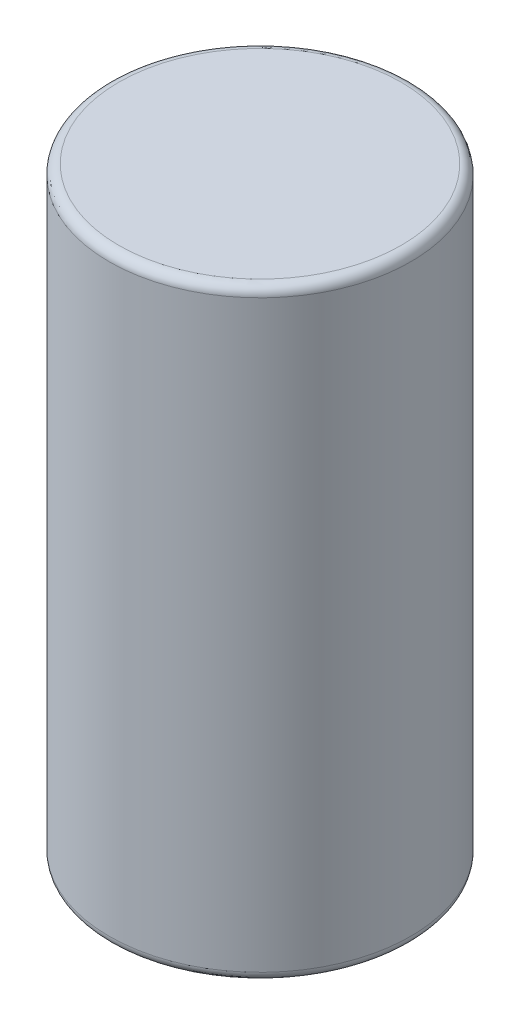
ISO-10303-21;
HEADER;
FILE_DESCRIPTION(('STEP AP214'),'2;1');
FILE_NAME('part.step','',(''),(''),'','','');
FILE_SCHEMA(('AUTOMOTIVE_DESIGN { 1 0 10303 214 1 1 1 1 }'));
ENDSEC;
DATA;
#1=APPLICATION_CONTEXT('core data for automotive mechanical design processes');
#2=APPLICATION_PROTOCOL_DEFINITION('international standard','automotive_design',2000,#1);
#3=PRODUCT_CONTEXT('',#1,'mechanical');
#4=PRODUCT('Part','Part','',(#3));
#5=PRODUCT_RELATED_PRODUCT_CATEGORY('part','',(#4));
#6=PRODUCT_DEFINITION_FORMATION('','',#4);
#7=PRODUCT_DEFINITION_CONTEXT('part definition',#1,'design');
#8=PRODUCT_DEFINITION('design','',#6,#7);
#9=PRODUCT_DEFINITION_SHAPE('','',#8);
#10=(LENGTH_UNIT() NAMED_UNIT(*) SI_UNIT(.MILLI.,.METRE.));
#11=(NAMED_UNIT(*) PLANE_ANGLE_UNIT() SI_UNIT($,.RADIAN.));
#12=(NAMED_UNIT(*) SI_UNIT($,.STERADIAN.) SOLID_ANGLE_UNIT());
#13=UNCERTAINTY_MEASURE_WITH_UNIT(LENGTH_MEASURE(1.E-05),#10,'distance_accuracy_value','');
#14=(GEOMETRIC_REPRESENTATION_CONTEXT(3) GLOBAL_UNCERTAINTY_ASSIGNED_CONTEXT((#13)) GLOBAL_UNIT_ASSIGNED_CONTEXT((#10,
#11,#12)) REPRESENTATION_CONTEXT('',''));
#15=CARTESIAN_POINT('',(0.,0.,0.));
#16=DIRECTION('',(0.,0.,1.));
#17=DIRECTION('',(1.,0.,0.));
#18=AXIS2_PLACEMENT_3D('',#15,#16,#17);
#19=CARTESIAN_POINT('',(0.,12.7,0.));
#20=DIRECTION('',(0.,1.,0.));
#21=DIRECTION('',(0.,0.,1.));
#22=AXIS2_PLACEMENT_3D('',#19,#20,#21);
#23=PLANE('',#22);
#24=CARTESIAN_POINT('',(0.,12.7,0.));
#25=DIRECTION('',(0.,1.,0.));
#26=DIRECTION('',(0.,0.,1.));
#27=AXIS2_PLACEMENT_3D('',#24,#25,#26);
#28=CIRCLE('',#27,2.975);
#29=CARTESIAN_POINT('',(0.,12.7,2.975));
#30=VERTEX_POINT('',#29);
#31=EDGE_CURVE('E10',#30,#30,#28,.T.);
#32=ORIENTED_EDGE('',*,*,#31,.T.);
#33=EDGE_LOOP('',(#32));
#34=FACE_BOUND('',#33,.T.);
#35=ADVANCED_FACE('F33',(#34),#23,.T.);
#36=CARTESIAN_POINT('',(0.,0.,0.));
#37=DIRECTION('',(0.,-1.,0.));
#38=DIRECTION('',(0.,0.,-1.));
#39=AXIS2_PLACEMENT_3D('',#36,#37,#38);
#40=CYLINDRICAL_SURFACE('',#39,3.175);
#41=CARTESIAN_POINT('',(0.,0.2,0.));
#42=DIRECTION('',(0.,-1.,0.));
#43=DIRECTION('',(0.,0.,-1.));
#44=AXIS2_PLACEMENT_3D('',#41,#42,#43);
#45=CIRCLE('',#44,3.175);
#46=CARTESIAN_POINT('',(0.,0.2,-3.175));
#47=VERTEX_POINT('',#46);
#48=EDGE_CURVE('E40',#47,#47,#45,.F.);
#49=ORIENTED_EDGE('',*,*,#48,.T.);
#50=EDGE_LOOP('',(#49));
#51=FACE_BOUND('',#50,.T.);
#52=CARTESIAN_POINT('',(0.,12.5,0.));
#53=DIRECTION('',(0.,1.,0.));
#54=DIRECTION('',(0.,0.,1.));
#55=AXIS2_PLACEMENT_3D('',#52,#53,#54);
#56=CIRCLE('',#55,3.175);
#57=CARTESIAN_POINT('',(0.,12.5,3.175));
#58=VERTEX_POINT('',#57);
#59=EDGE_CURVE('E44',#58,#58,#56,.F.);
#60=ORIENTED_EDGE('',*,*,#59,.T.);
#61=EDGE_LOOP('',(#60));
#62=FACE_BOUND('',#61,.T.);
#63=ADVANCED_FACE('F64',(#51,#62),#40,.T.);
#64=CARTESIAN_POINT('',(3.175,0.,0.));
#65=DIRECTION('',(0.,-1.,0.));
#66=DIRECTION('',(0.,0.,-1.));
#67=AXIS2_PLACEMENT_3D('',#64,#65,#66);
#68=PLANE('',#67);
#69=CARTESIAN_POINT('',(0.,0.,0.));
#70=DIRECTION('',(0.,-1.,0.));
#71=DIRECTION('',(0.,0.,-1.));
#72=AXIS2_PLACEMENT_3D('',#69,#70,#71);
#73=CIRCLE('',#72,2.975);
#74=CARTESIAN_POINT('',(0.,0.,-2.975));
#75=VERTEX_POINT('',#74);
#76=EDGE_CURVE('E48',#75,#75,#73,.T.);
#77=ORIENTED_EDGE('',*,*,#76,.T.);
#78=EDGE_LOOP('',(#77));
#79=FACE_BOUND('',#78,.T.);
#80=ADVANCED_FACE('F54',(#79),#68,.T.);
#81=CARTESIAN_POINT('',(0.,0.2,0.));
#82=DIRECTION('',(0.,-1.,0.));
#83=DIRECTION('',(0.,0.,-1.));
#84=AXIS2_PLACEMENT_3D('',#81,#82,#83);
#85=TOROIDAL_SURFACE('',#84,2.975,0.2);
#86=ORIENTED_EDGE('',*,*,#48,.F.);
#87=EDGE_LOOP('',(#86));
#88=FACE_BOUND('',#87,.T.);
#89=ORIENTED_EDGE('',*,*,#76,.F.);
#90=EDGE_LOOP('',(#89));
#91=FACE_BOUND('',#90,.T.);
#92=ADVANCED_FACE('F56',(#88,#91),#85,.T.);
#93=CARTESIAN_POINT('',(0.,12.5,0.));
#94=DIRECTION('',(0.,1.,0.));
#95=DIRECTION('',(0.,0.,1.));
#96=AXIS2_PLACEMENT_3D('',#93,#94,#95);
#97=TOROIDAL_SURFACE('',#96,2.975,0.2);
#98=ORIENTED_EDGE('',*,*,#31,.F.);
#99=EDGE_LOOP('',(#98));
#100=FACE_BOUND('',#99,.T.);
#101=ORIENTED_EDGE('',*,*,#59,.F.);
#102=EDGE_LOOP('',(#101));
#103=FACE_BOUND('',#102,.T.);
#104=ADVANCED_FACE('F35',(#100,#103),#97,.T.);
#105=CLOSED_SHELL('',(#35,#63,#80,#92,#104));
#106=MANIFOLD_SOLID_BREP('B2',#105);
#107=ADVANCED_BREP_SHAPE_REPRESENTATION('',(#18,#106),#14);
#108=SHAPE_DEFINITION_REPRESENTATION(#9,#107);
ENDSEC;
END-ISO-10303-21;
